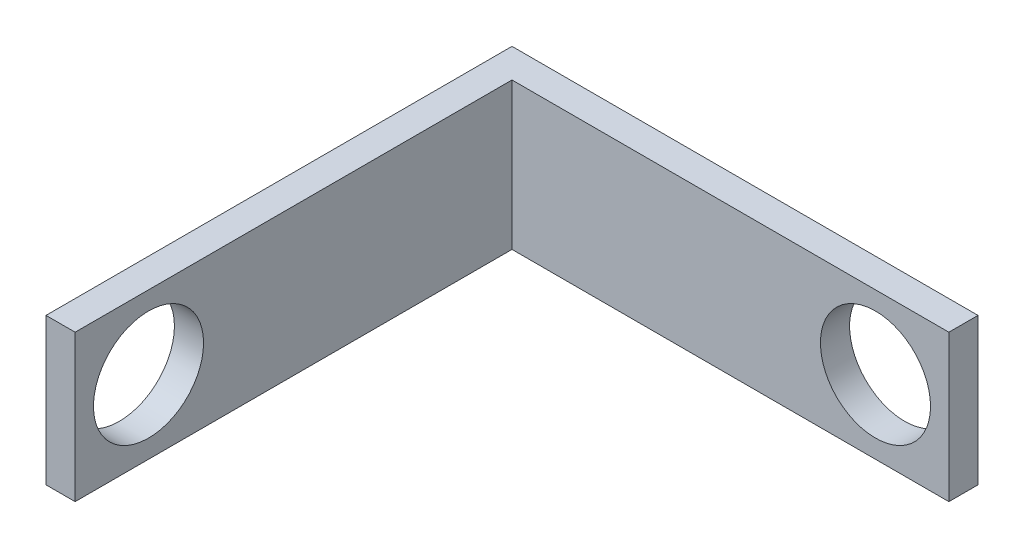
ISO-10303-21;
HEADER;
FILE_DESCRIPTION(('STEP AP214'),'2;1');
FILE_NAME('part.step','',(''),(''),'','','');
FILE_SCHEMA(('AUTOMOTIVE_DESIGN { 1 0 10303 214 1 1 1 1 }'));
ENDSEC;
DATA;
#1=APPLICATION_CONTEXT('core data for automotive mechanical design processes');
#2=APPLICATION_PROTOCOL_DEFINITION('international standard','automotive_design',2000,#1);
#3=PRODUCT_CONTEXT('',#1,'mechanical');
#4=PRODUCT('Part','Part','',(#3));
#5=PRODUCT_RELATED_PRODUCT_CATEGORY('part','',(#4));
#6=PRODUCT_DEFINITION_FORMATION('','',#4);
#7=PRODUCT_DEFINITION_CONTEXT('part definition',#1,'design');
#8=PRODUCT_DEFINITION('design','',#6,#7);
#9=PRODUCT_DEFINITION_SHAPE('','',#8);
#10=(LENGTH_UNIT() NAMED_UNIT(*) SI_UNIT(.MILLI.,.METRE.));
#11=(NAMED_UNIT(*) PLANE_ANGLE_UNIT() SI_UNIT($,.RADIAN.));
#12=(NAMED_UNIT(*) SI_UNIT($,.STERADIAN.) SOLID_ANGLE_UNIT());
#13=UNCERTAINTY_MEASURE_WITH_UNIT(LENGTH_MEASURE(1.E-05),#10,'distance_accuracy_value','');
#14=(GEOMETRIC_REPRESENTATION_CONTEXT(3) GLOBAL_UNCERTAINTY_ASSIGNED_CONTEXT((#13)) GLOBAL_UNIT_ASSIGNED_CONTEXT((#10,
#11,#12)) REPRESENTATION_CONTEXT('',''));
#15=CARTESIAN_POINT('',(0.,0.,0.));
#16=DIRECTION('',(0.,0.,1.));
#17=DIRECTION('',(1.,0.,0.));
#18=AXIS2_PLACEMENT_3D('',#15,#16,#17);
#19=CARTESIAN_POINT('',(0.,4.,-21.4));
#20=DIRECTION('',(0.,0.,1.));
#21=DIRECTION('',(1.,0.,0.));
#22=AXIS2_PLACEMENT_3D('',#19,#20,#21);
#23=PLANE('',#22);
#24=CARTESIAN_POINT('',(0.,0.,-21.4));
#25=DIRECTION('',(0.,0.,1.));
#26=DIRECTION('',(1.,0.,0.));
#27=AXIS2_PLACEMENT_3D('',#24,#25,#26);
#28=CIRCLE('',#27,3.);
#29=CARTESIAN_POINT('',(3.,0.,-21.4));
#30=VERTEX_POINT('',#29);
#31=EDGE_CURVE('E186',#30,#30,#28,.T.);
#32=ORIENTED_EDGE('',*,*,#31,.T.);
#33=EDGE_LOOP('',(#32));
#34=FACE_BOUND('',#33,.T.);
#35=DIRECTION('',(-1.,0.,0.));
#36=VECTOR('',#35,1.);
#37=CARTESIAN_POINT('',(0.,-4.,-21.4));
#38=LINE('',#37,#36);
#39=CARTESIAN_POINT('',(4.,-4.,-21.4));
#40=VERTEX_POINT('',#39);
#41=CARTESIAN_POINT('',(-21.4,-4.,-21.4));
#42=VERTEX_POINT('',#41);
#43=EDGE_CURVE('E131',#40,#42,#38,.T.);
#44=ORIENTED_EDGE('',*,*,#43,.T.);
#45=DIRECTION('',(0.,-1.,0.));
#46=VECTOR('',#45,1.);
#47=CARTESIAN_POINT('',(-21.4,4.,-21.4));
#48=LINE('',#47,#46);
#49=CARTESIAN_POINT('',(-21.4,4.,-21.4));
#50=VERTEX_POINT('',#49);
#51=EDGE_CURVE('E11',#50,#42,#48,.T.);
#52=ORIENTED_EDGE('',*,*,#51,.F.);
#53=DIRECTION('',(-1.,0.,0.));
#54=VECTOR('',#53,1.);
#55=CARTESIAN_POINT('',(0.,4.,-21.4));
#56=LINE('',#55,#54);
#57=CARTESIAN_POINT('',(4.,4.,-21.4));
#58=VERTEX_POINT('',#57);
#59=EDGE_CURVE('E149',#58,#50,#56,.T.);
#60=ORIENTED_EDGE('',*,*,#59,.F.);
#61=DIRECTION('',(0.,-1.,0.));
#62=VECTOR('',#61,1.);
#63=CARTESIAN_POINT('',(4.,4.,-21.4));
#64=LINE('',#63,#62);
#65=EDGE_CURVE('E130',#58,#40,#64,.T.);
#66=ORIENTED_EDGE('',*,*,#65,.T.);
#67=EDGE_LOOP('',(#44,#52,#60,#66));
#68=FACE_BOUND('',#67,.T.);
#69=ADVANCED_FACE('F41',(#34,#68),#23,.F.);
#70=CARTESIAN_POINT('',(-21.4,4.,0.));
#71=DIRECTION('',(1.,0.,0.));
#72=DIRECTION('',(0.,0.,-1.));
#73=AXIS2_PLACEMENT_3D('',#70,#71,#72);
#74=PLANE('',#73);
#75=CARTESIAN_POINT('',(-21.4,0.,0.));
#76=DIRECTION('',(1.,0.,0.));
#77=DIRECTION('',(0.,0.,-1.));
#78=AXIS2_PLACEMENT_3D('',#75,#76,#77);
#79=CIRCLE('',#78,3.);
#80=CARTESIAN_POINT('',(-21.4,0.,-3.));
#81=VERTEX_POINT('',#80);
#82=EDGE_CURVE('E136',#81,#81,#79,.T.);
#83=ORIENTED_EDGE('',*,*,#82,.T.);
#84=EDGE_LOOP('',(#83));
#85=FACE_BOUND('',#84,.T.);
#86=DIRECTION('',(0.,0.,1.));
#87=VECTOR('',#86,1.);
#88=CARTESIAN_POINT('',(-21.4,-4.,0.));
#89=LINE('',#88,#87);
#90=CARTESIAN_POINT('',(-21.4,-4.,4.));
#91=VERTEX_POINT('',#90);
#92=EDGE_CURVE('E135',#42,#91,#89,.T.);
#93=ORIENTED_EDGE('',*,*,#92,.T.);
#94=DIRECTION('',(0.,-1.,0.));
#95=VECTOR('',#94,1.);
#96=CARTESIAN_POINT('',(-21.4,4.,4.));
#97=LINE('',#96,#95);
#98=CARTESIAN_POINT('',(-21.4,4.,4.));
#99=VERTEX_POINT('',#98);
#100=EDGE_CURVE('E50',#99,#91,#97,.T.);
#101=ORIENTED_EDGE('',*,*,#100,.F.);
#102=DIRECTION('',(0.,0.,1.));
#103=VECTOR('',#102,1.);
#104=CARTESIAN_POINT('',(-21.4,4.,0.));
#105=LINE('',#104,#103);
#106=EDGE_CURVE('E94',#50,#99,#105,.T.);
#107=ORIENTED_EDGE('',*,*,#106,.F.);
#108=ORIENTED_EDGE('',*,*,#51,.T.);
#109=EDGE_LOOP('',(#93,#101,#107,#108));
#110=FACE_BOUND('',#109,.T.);
#111=ADVANCED_FACE('F178',(#85,#110),#74,.F.);
#112=CARTESIAN_POINT('',(0.,4.,4.));
#113=DIRECTION('',(0.,0.,-1.));
#114=DIRECTION('',(-1.,0.,0.));
#115=AXIS2_PLACEMENT_3D('',#112,#113,#114);
#116=PLANE('',#115);
#117=DIRECTION('',(1.,0.,0.));
#118=VECTOR('',#117,1.);
#119=CARTESIAN_POINT('',(0.,-4.,4.));
#120=LINE('',#119,#118);
#121=CARTESIAN_POINT('',(-19.8125,-4.,4.));
#122=VERTEX_POINT('',#121);
#123=EDGE_CURVE('E139',#91,#122,#120,.T.);
#124=ORIENTED_EDGE('',*,*,#123,.T.);
#125=DIRECTION('',(0.,-1.,0.));
#126=VECTOR('',#125,1.);
#127=CARTESIAN_POINT('',(-19.8125,4.,4.));
#128=LINE('',#127,#126);
#129=CARTESIAN_POINT('',(-19.8125,4.,4.));
#130=VERTEX_POINT('',#129);
#131=EDGE_CURVE('E111',#130,#122,#128,.T.);
#132=ORIENTED_EDGE('',*,*,#131,.F.);
#133=DIRECTION('',(1.,0.,0.));
#134=VECTOR('',#133,1.);
#135=CARTESIAN_POINT('',(0.,4.,4.));
#136=LINE('',#135,#134);
#137=EDGE_CURVE('E120',#99,#130,#136,.T.);
#138=ORIENTED_EDGE('',*,*,#137,.F.);
#139=ORIENTED_EDGE('',*,*,#100,.T.);
#140=EDGE_LOOP('',(#124,#132,#138,#139));
#141=FACE_BOUND('',#140,.T.);
#142=ADVANCED_FACE('F159',(#141),#116,.F.);
#143=CARTESIAN_POINT('',(-19.8125,4.,0.));
#144=DIRECTION('',(1.,0.,0.));
#145=DIRECTION('',(0.,0.,-1.));
#146=AXIS2_PLACEMENT_3D('',#143,#144,#145);
#147=PLANE('',#146);
#148=CARTESIAN_POINT('',(-19.8125,0.,0.));
#149=DIRECTION('',(1.,0.,0.));
#150=DIRECTION('',(0.,0.,-1.));
#151=AXIS2_PLACEMENT_3D('',#148,#149,#150);
#152=CIRCLE('',#151,3.);
#153=CARTESIAN_POINT('',(-19.8125,0.,-3.));
#154=VERTEX_POINT('',#153);
#155=EDGE_CURVE('E189',#154,#154,#152,.T.);
#156=ORIENTED_EDGE('',*,*,#155,.F.);
#157=EDGE_LOOP('',(#156));
#158=FACE_BOUND('',#157,.T.);
#159=DIRECTION('',(0.,0.,1.));
#160=VECTOR('',#159,1.);
#161=CARTESIAN_POINT('',(-19.8125,-4.,0.));
#162=LINE('',#161,#160);
#163=CARTESIAN_POINT('',(-19.8125,-4.,-19.8125));
#164=VERTEX_POINT('',#163);
#165=EDGE_CURVE('E109',#164,#122,#162,.T.);
#166=ORIENTED_EDGE('',*,*,#165,.F.);
#167=DIRECTION('',(0.,-1.,0.));
#168=VECTOR('',#167,1.);
#169=CARTESIAN_POINT('',(-19.8125,4.,-19.8125));
#170=LINE('',#169,#168);
#171=CARTESIAN_POINT('',(-19.8125,4.,-19.8125));
#172=VERTEX_POINT('',#171);
#173=EDGE_CURVE('E103',#172,#164,#170,.T.);
#174=ORIENTED_EDGE('',*,*,#173,.F.);
#175=DIRECTION('',(0.,0.,1.));
#176=VECTOR('',#175,1.);
#177=CARTESIAN_POINT('',(-19.8125,4.,0.));
#178=LINE('',#177,#176);
#179=EDGE_CURVE('E107',#172,#130,#178,.T.);
#180=ORIENTED_EDGE('',*,*,#179,.T.);
#181=ORIENTED_EDGE('',*,*,#131,.T.);
#182=EDGE_LOOP('',(#166,#174,#180,#181));
#183=FACE_BOUND('',#182,.T.);
#184=ADVANCED_FACE('F105',(#158,#183),#147,.T.);
#185=CARTESIAN_POINT('',(0.,4.,-19.8125));
#186=DIRECTION('',(0.,0.,-1.));
#187=DIRECTION('',(-1.,0.,0.));
#188=AXIS2_PLACEMENT_3D('',#185,#186,#187);
#189=PLANE('',#188);
#190=CARTESIAN_POINT('',(0.,0.,-19.8125));
#191=DIRECTION('',(0.,0.,1.));
#192=DIRECTION('',(1.,0.,0.));
#193=AXIS2_PLACEMENT_3D('',#190,#191,#192);
#194=CIRCLE('',#193,3.);
#195=CARTESIAN_POINT('',(3.,0.,-19.8125));
#196=VERTEX_POINT('',#195);
#197=EDGE_CURVE('E190',#196,#196,#194,.T.);
#198=ORIENTED_EDGE('',*,*,#197,.F.);
#199=EDGE_LOOP('',(#198));
#200=FACE_BOUND('',#199,.T.);
#201=DIRECTION('',(1.,0.,0.));
#202=VECTOR('',#201,1.);
#203=CARTESIAN_POINT('',(0.,-4.,-19.8125));
#204=LINE('',#203,#202);
#205=CARTESIAN_POINT('',(4.,-4.,-19.8125));
#206=VERTEX_POINT('',#205);
#207=EDGE_CURVE('E80',#164,#206,#204,.T.);
#208=ORIENTED_EDGE('',*,*,#207,.T.);
#209=DIRECTION('',(0.,-1.,0.));
#210=VECTOR('',#209,1.);
#211=CARTESIAN_POINT('',(4.,4.,-19.8125));
#212=LINE('',#211,#210);
#213=CARTESIAN_POINT('',(4.,4.,-19.8125));
#214=VERTEX_POINT('',#213);
#215=EDGE_CURVE('E112',#214,#206,#212,.T.);
#216=ORIENTED_EDGE('',*,*,#215,.F.);
#217=DIRECTION('',(1.,0.,0.));
#218=VECTOR('',#217,1.);
#219=CARTESIAN_POINT('',(0.,4.,-19.8125));
#220=LINE('',#219,#218);
#221=EDGE_CURVE('E114',#172,#214,#220,.T.);
#222=ORIENTED_EDGE('',*,*,#221,.F.);
#223=ORIENTED_EDGE('',*,*,#173,.T.);
#224=EDGE_LOOP('',(#208,#216,#222,#223));
#225=FACE_BOUND('',#224,.T.);
#226=ADVANCED_FACE('F115',(#200,#225),#189,.F.);
#227=CARTESIAN_POINT('',(4.,4.,0.));
#228=DIRECTION('',(-1.,0.,0.));
#229=DIRECTION('',(0.,0.,1.));
#230=AXIS2_PLACEMENT_3D('',#227,#228,#229);
#231=PLANE('',#230);
#232=DIRECTION('',(0.,0.,-1.));
#233=VECTOR('',#232,1.);
#234=CARTESIAN_POINT('',(4.,-4.,0.));
#235=LINE('',#234,#233);
#236=EDGE_CURVE('E86',#206,#40,#235,.T.);
#237=ORIENTED_EDGE('',*,*,#236,.T.);
#238=ORIENTED_EDGE('',*,*,#65,.F.);
#239=DIRECTION('',(0.,0.,-1.));
#240=VECTOR('',#239,1.);
#241=CARTESIAN_POINT('',(4.,4.,0.));
#242=LINE('',#241,#240);
#243=EDGE_CURVE('E58',#214,#58,#242,.T.);
#244=ORIENTED_EDGE('',*,*,#243,.F.);
#245=ORIENTED_EDGE('',*,*,#215,.T.);
#246=EDGE_LOOP('',(#237,#238,#244,#245));
#247=FACE_BOUND('',#246,.T.);
#248=ADVANCED_FACE('F166',(#247),#231,.F.);
#249=CARTESIAN_POINT('',(0.,4.,0.));
#250=DIRECTION('',(0.,1.,0.));
#251=DIRECTION('',(0.,0.,1.));
#252=AXIS2_PLACEMENT_3D('',#249,#250,#251);
#253=PLANE('',#252);
#254=ORIENTED_EDGE('',*,*,#59,.T.);
#255=ORIENTED_EDGE('',*,*,#106,.T.);
#256=ORIENTED_EDGE('',*,*,#137,.T.);
#257=ORIENTED_EDGE('',*,*,#179,.F.);
#258=ORIENTED_EDGE('',*,*,#221,.T.);
#259=ORIENTED_EDGE('',*,*,#243,.T.);
#260=EDGE_LOOP('',(#254,#255,#256,#257,#258,#259));
#261=FACE_BOUND('',#260,.T.);
#262=ADVANCED_FACE('F118',(#261),#253,.T.);
#263=CARTESIAN_POINT('',(0.,-4.,0.));
#264=DIRECTION('',(0.,1.,0.));
#265=DIRECTION('',(0.,0.,1.));
#266=AXIS2_PLACEMENT_3D('',#263,#264,#265);
#267=PLANE('',#266);
#268=ORIENTED_EDGE('',*,*,#43,.F.);
#269=ORIENTED_EDGE('',*,*,#236,.F.);
#270=ORIENTED_EDGE('',*,*,#207,.F.);
#271=ORIENTED_EDGE('',*,*,#165,.T.);
#272=ORIENTED_EDGE('',*,*,#123,.F.);
#273=ORIENTED_EDGE('',*,*,#92,.F.);
#274=EDGE_LOOP('',(#268,#269,#270,#271,#272,#273));
#275=FACE_BOUND('',#274,.T.);
#276=ADVANCED_FACE('F162',(#275),#267,.F.);
#277=CARTESIAN_POINT('',(-21.4,0.,0.));
#278=DIRECTION('',(1.,0.,0.));
#279=DIRECTION('',(0.,0.,-1.));
#280=AXIS2_PLACEMENT_3D('',#277,#278,#279);
#281=CYLINDRICAL_SURFACE('',#280,3.);
#282=CARTESIAN_POINT('',(-21.4,0.,-3.));
#283=CARTESIAN_POINT('',(-21.3834635416667,0.,-3.));
#284=CARTESIAN_POINT('',(-21.3669270833333,0.,-3.));
#285=CARTESIAN_POINT('',(-21.3338541666667,0.,-3.));
#286=CARTESIAN_POINT('',(-21.3173177083333,0.,-3.));
#287=CARTESIAN_POINT('',(-21.2842447916667,0.,-3.));
#288=CARTESIAN_POINT('',(-21.2677083333333,0.,-3.));
#289=CARTESIAN_POINT('',(-21.2346354166667,0.,-3.));
#290=CARTESIAN_POINT('',(-21.2180989583333,0.,-3.));
#291=CARTESIAN_POINT('',(-21.1850260416667,0.,-3.));
#292=CARTESIAN_POINT('',(-21.1684895833333,0.,-3.));
#293=CARTESIAN_POINT('',(-21.1354166666667,0.,-3.));
#294=CARTESIAN_POINT('',(-21.1188802083333,0.,-3.));
#295=CARTESIAN_POINT('',(-21.0858072916667,0.,-3.));
#296=CARTESIAN_POINT('',(-21.0692708333333,0.,-3.));
#297=CARTESIAN_POINT('',(-21.0361979166667,0.,-3.));
#298=CARTESIAN_POINT('',(-21.0196614583333,0.,-3.));
#299=CARTESIAN_POINT('',(-20.9865885416667,0.,-3.));
#300=CARTESIAN_POINT('',(-20.9700520833333,0.,-3.));
#301=CARTESIAN_POINT('',(-20.9369791666667,0.,-3.));
#302=CARTESIAN_POINT('',(-20.9204427083333,0.,-3.));
#303=CARTESIAN_POINT('',(-20.8873697916667,0.,-3.));
#304=CARTESIAN_POINT('',(-20.8708333333333,0.,-3.));
#305=CARTESIAN_POINT('',(-20.8377604166667,0.,-3.));
#306=CARTESIAN_POINT('',(-20.8212239583333,0.,-3.));
#307=CARTESIAN_POINT('',(-20.7881510416667,0.,-3.));
#308=CARTESIAN_POINT('',(-20.7716145833333,0.,-3.));
#309=CARTESIAN_POINT('',(-20.7385416666667,0.,-3.));
#310=CARTESIAN_POINT('',(-20.7220052083333,0.,-3.));
#311=CARTESIAN_POINT('',(-20.6889322916667,0.,-3.));
#312=CARTESIAN_POINT('',(-20.6723958333333,0.,-3.));
#313=CARTESIAN_POINT('',(-20.6393229166667,0.,-3.));
#314=CARTESIAN_POINT('',(-20.6227864583333,0.,-3.));
#315=CARTESIAN_POINT('',(-20.5897135416667,0.,-3.));
#316=CARTESIAN_POINT('',(-20.5731770833333,0.,-3.));
#317=CARTESIAN_POINT('',(-20.5401041666667,0.,-3.));
#318=CARTESIAN_POINT('',(-20.5235677083333,0.,-3.));
#319=CARTESIAN_POINT('',(-20.4904947916667,0.,-3.));
#320=CARTESIAN_POINT('',(-20.4739583333333,0.,-3.));
#321=CARTESIAN_POINT('',(-20.4408854166667,0.,-3.));
#322=CARTESIAN_POINT('',(-20.4243489583333,0.,-3.));
#323=CARTESIAN_POINT('',(-20.3912760416667,0.,-3.));
#324=CARTESIAN_POINT('',(-20.3747395833333,0.,-3.));
#325=CARTESIAN_POINT('',(-20.3416666666667,0.,-3.));
#326=CARTESIAN_POINT('',(-20.3251302083333,0.,-3.));
#327=CARTESIAN_POINT('',(-20.2920572916667,0.,-3.));
#328=CARTESIAN_POINT('',(-20.2755208333333,0.,-3.));
#329=CARTESIAN_POINT('',(-20.2424479166667,0.,-3.));
#330=CARTESIAN_POINT('',(-20.2259114583333,0.,-3.));
#331=CARTESIAN_POINT('',(-20.1928385416667,0.,-3.));
#332=CARTESIAN_POINT('',(-20.1763020833333,0.,-3.));
#333=CARTESIAN_POINT('',(-20.1432291666667,0.,-3.));
#334=CARTESIAN_POINT('',(-20.1266927083333,0.,-3.));
#335=CARTESIAN_POINT('',(-20.0936197916667,0.,-3.));
#336=CARTESIAN_POINT('',(-20.0770833333333,0.,-3.));
#337=CARTESIAN_POINT('',(-20.0440104166667,0.,-3.));
#338=CARTESIAN_POINT('',(-20.0274739583333,0.,-3.));
#339=CARTESIAN_POINT('',(-19.9944010416667,0.,-3.));
#340=CARTESIAN_POINT('',(-19.9778645833333,0.,-3.));
#341=CARTESIAN_POINT('',(-19.9447916666667,0.,-3.));
#342=CARTESIAN_POINT('',(-19.9282552083333,0.,-3.));
#343=CARTESIAN_POINT('',(-19.8951822916667,0.,-3.));
#344=CARTESIAN_POINT('',(-19.8786458333333,0.,-3.));
#345=CARTESIAN_POINT('',(-19.8455729166667,0.,-3.));
#346=CARTESIAN_POINT('',(-19.8290364583333,0.,-3.));
#347=CARTESIAN_POINT('',(-19.8125,0.,-3.));
#348=B_SPLINE_CURVE_WITH_KNOTS('',3,(#282,#283,#284,#285,#286,#287,#288,#289,#290,#291,#292,
#293,#294,#295,#296,#297,#298,#299,#300,#301,#302,#303,#304,#305,#306,#307,#308,#309,#310,#311,
#312,#313,#314,#315,#316,#317,#318,#319,#320,#321,#322,#323,#324,#325,#326,#327,#328,#329,#330,
#331,#332,#333,#334,#335,#336,#337,#338,#339,#340,#341,#342,#343,#344,#345,#346,#347),
.UNSPECIFIED.,.F.,.F.,(4,2,2,2,2,2,2,2,2,2,2,2,2,2,2,2,2,2,2,2,2,2,2,2,2,2,2,2,2,2,2,2,4),(0.,
0.0496093749999989,0.0992187499999977,0.148828125,0.198437499999999,0.248046874999998,
0.29765625,0.347265624999999,0.396874999999998,0.446484375,0.496093749999999,0.545703124999998,
0.5953125,0.644921874999999,0.694531249999998,0.744140625,0.793749999999999,0.843359374999998,
0.892968750000001,0.942578124999999,0.992187499999998,1.041796875,1.09140625,1.141015625,
1.190625,1.240234375,1.28984375,1.339453125,1.3890625,1.438671875,1.48828125,1.537890625,
1.5875),.UNSPECIFIED.);
#349=EDGE_CURVE('BSEAM206',#81,#154,#348,.T.);
#350=ORIENTED_EDGE('',*,*,#82,.F.);
#351=ORIENTED_EDGE('',*,*,#155,.T.);
#352=ORIENTED_EDGE('',*,*,#349,.T.);
#353=ORIENTED_EDGE('',*,*,#349,.F.);
#354=EDGE_LOOP('',(#350,#352,#351,#353));
#355=FACE_BOUND('',#354,.T.);
#356=ADVANCED_FACE('F206',(#355),#281,.F.);
#357=CARTESIAN_POINT('',(0.,0.,-21.4));
#358=DIRECTION('',(0.,0.,1.));
#359=DIRECTION('',(1.,0.,0.));
#360=AXIS2_PLACEMENT_3D('',#357,#358,#359);
#361=CYLINDRICAL_SURFACE('',#360,3.);
#362=CARTESIAN_POINT('',(3.,0.,-21.4));
#363=CARTESIAN_POINT('',(3.,0.,-21.3834635416667));
#364=CARTESIAN_POINT('',(3.,0.,-21.3669270833333));
#365=CARTESIAN_POINT('',(3.,0.,-21.3338541666667));
#366=CARTESIAN_POINT('',(3.,0.,-21.3173177083333));
#367=CARTESIAN_POINT('',(3.,0.,-21.2842447916667));
#368=CARTESIAN_POINT('',(3.,0.,-21.2677083333333));
#369=CARTESIAN_POINT('',(3.,0.,-21.2346354166667));
#370=CARTESIAN_POINT('',(3.,0.,-21.2180989583333));
#371=CARTESIAN_POINT('',(3.,0.,-21.1850260416667));
#372=CARTESIAN_POINT('',(3.,0.,-21.1684895833333));
#373=CARTESIAN_POINT('',(3.,0.,-21.1354166666667));
#374=CARTESIAN_POINT('',(3.,0.,-21.1188802083333));
#375=CARTESIAN_POINT('',(3.,0.,-21.0858072916667));
#376=CARTESIAN_POINT('',(3.,0.,-21.0692708333333));
#377=CARTESIAN_POINT('',(3.,0.,-21.0361979166667));
#378=CARTESIAN_POINT('',(3.,0.,-21.0196614583333));
#379=CARTESIAN_POINT('',(3.,0.,-20.9865885416667));
#380=CARTESIAN_POINT('',(3.,0.,-20.9700520833333));
#381=CARTESIAN_POINT('',(3.,0.,-20.9369791666667));
#382=CARTESIAN_POINT('',(3.,0.,-20.9204427083333));
#383=CARTESIAN_POINT('',(3.,0.,-20.8873697916667));
#384=CARTESIAN_POINT('',(3.,0.,-20.8708333333333));
#385=CARTESIAN_POINT('',(3.,0.,-20.8377604166667));
#386=CARTESIAN_POINT('',(3.,0.,-20.8212239583333));
#387=CARTESIAN_POINT('',(3.,0.,-20.7881510416667));
#388=CARTESIAN_POINT('',(3.,0.,-20.7716145833333));
#389=CARTESIAN_POINT('',(3.,0.,-20.7385416666667));
#390=CARTESIAN_POINT('',(3.,0.,-20.7220052083333));
#391=CARTESIAN_POINT('',(3.,0.,-20.6889322916667));
#392=CARTESIAN_POINT('',(3.,0.,-20.6723958333333));
#393=CARTESIAN_POINT('',(3.,0.,-20.6393229166667));
#394=CARTESIAN_POINT('',(3.,0.,-20.6227864583333));
#395=CARTESIAN_POINT('',(3.,0.,-20.5897135416667));
#396=CARTESIAN_POINT('',(3.,0.,-20.5731770833333));
#397=CARTESIAN_POINT('',(3.,0.,-20.5401041666667));
#398=CARTESIAN_POINT('',(3.,0.,-20.5235677083333));
#399=CARTESIAN_POINT('',(3.,0.,-20.4904947916667));
#400=CARTESIAN_POINT('',(3.,0.,-20.4739583333333));
#401=CARTESIAN_POINT('',(3.,0.,-20.4408854166667));
#402=CARTESIAN_POINT('',(3.,0.,-20.4243489583333));
#403=CARTESIAN_POINT('',(3.,0.,-20.3912760416667));
#404=CARTESIAN_POINT('',(3.,0.,-20.3747395833333));
#405=CARTESIAN_POINT('',(3.,0.,-20.3416666666667));
#406=CARTESIAN_POINT('',(3.,0.,-20.3251302083333));
#407=CARTESIAN_POINT('',(3.,0.,-20.2920572916667));
#408=CARTESIAN_POINT('',(3.,0.,-20.2755208333333));
#409=CARTESIAN_POINT('',(3.,0.,-20.2424479166667));
#410=CARTESIAN_POINT('',(3.,0.,-20.2259114583333));
#411=CARTESIAN_POINT('',(3.,0.,-20.1928385416667));
#412=CARTESIAN_POINT('',(3.,0.,-20.1763020833333));
#413=CARTESIAN_POINT('',(3.,0.,-20.1432291666667));
#414=CARTESIAN_POINT('',(3.,0.,-20.1266927083333));
#415=CARTESIAN_POINT('',(3.,0.,-20.0936197916667));
#416=CARTESIAN_POINT('',(3.,0.,-20.0770833333333));
#417=CARTESIAN_POINT('',(3.,0.,-20.0440104166667));
#418=CARTESIAN_POINT('',(3.,0.,-20.0274739583333));
#419=CARTESIAN_POINT('',(3.,0.,-19.9944010416667));
#420=CARTESIAN_POINT('',(3.,0.,-19.9778645833333));
#421=CARTESIAN_POINT('',(3.,0.,-19.9447916666667));
#422=CARTESIAN_POINT('',(3.,0.,-19.9282552083333));
#423=CARTESIAN_POINT('',(3.,0.,-19.8951822916667));
#424=CARTESIAN_POINT('',(3.,0.,-19.8786458333333));
#425=CARTESIAN_POINT('',(3.,0.,-19.8455729166667));
#426=CARTESIAN_POINT('',(3.,0.,-19.8290364583333));
#427=CARTESIAN_POINT('',(3.,0.,-19.8125));
#428=B_SPLINE_CURVE_WITH_KNOTS('',3,(#362,#363,#364,#365,#366,#367,#368,#369,#370,#371,#372,
#373,#374,#375,#376,#377,#378,#379,#380,#381,#382,#383,#384,#385,#386,#387,#388,#389,#390,#391,
#392,#393,#394,#395,#396,#397,#398,#399,#400,#401,#402,#403,#404,#405,#406,#407,#408,#409,#410,
#411,#412,#413,#414,#415,#416,#417,#418,#419,#420,#421,#422,#423,#424,#425,#426,#427),
.UNSPECIFIED.,.F.,.F.,(4,2,2,2,2,2,2,2,2,2,2,2,2,2,2,2,2,2,2,2,2,2,2,2,2,2,2,2,2,2,2,2,4),(0.,
0.0496093749999989,0.0992187499999977,0.148828125,0.198437499999999,0.248046874999998,
0.29765625,0.347265624999999,0.396874999999998,0.446484375,0.496093749999999,0.545703124999998,
0.5953125,0.644921874999999,0.694531249999998,0.744140625,0.793749999999999,0.843359374999998,
0.892968750000001,0.942578124999999,0.992187499999998,1.041796875,1.09140625,1.141015625,
1.190625,1.240234375,1.28984375,1.339453125,1.3890625,1.438671875,1.48828125,1.537890625,
1.5875),.UNSPECIFIED.);
#429=EDGE_CURVE('BSEAM209',#30,#196,#428,.T.);
#430=ORIENTED_EDGE('',*,*,#31,.F.);
#431=ORIENTED_EDGE('',*,*,#197,.T.);
#432=ORIENTED_EDGE('',*,*,#429,.T.);
#433=ORIENTED_EDGE('',*,*,#429,.F.);
#434=EDGE_LOOP('',(#430,#432,#431,#433));
#435=FACE_BOUND('',#434,.T.);
#436=ADVANCED_FACE('F209',(#435),#361,.F.);
#437=CLOSED_SHELL('',(#69,#111,#142,#184,#226,#248,#262,#276,#356,#436));
#438=MANIFOLD_SOLID_BREP('B2',#437);
#439=ADVANCED_BREP_SHAPE_REPRESENTATION('',(#18,#438),#14);
#440=SHAPE_DEFINITION_REPRESENTATION(#9,#439);
ENDSEC;
END-ISO-10303-21;
